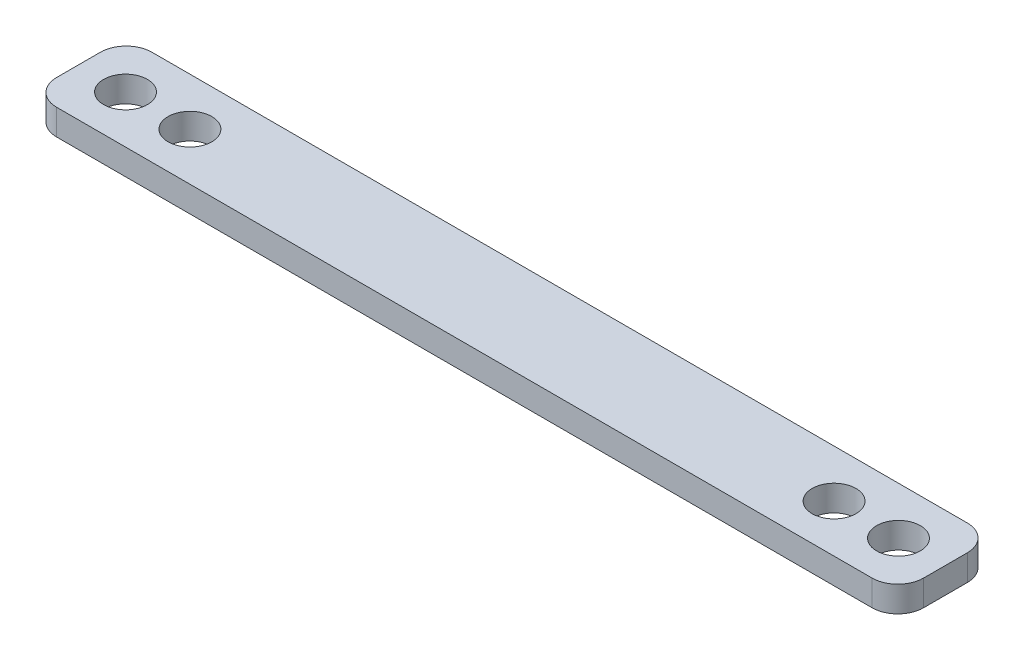
ISO-10303-21;
HEADER;
FILE_DESCRIPTION(('STEP AP214'),'2;1');
FILE_NAME('part.step','',(''),(''),'','','');
FILE_SCHEMA(('AUTOMOTIVE_DESIGN { 1 0 10303 214 1 1 1 1 }'));
ENDSEC;
DATA;
#1=APPLICATION_CONTEXT('core data for automotive mechanical design processes');
#2=APPLICATION_PROTOCOL_DEFINITION('international standard','automotive_design',2000,#1);
#3=PRODUCT_CONTEXT('',#1,'mechanical');
#4=PRODUCT('Part','Part','',(#3));
#5=PRODUCT_RELATED_PRODUCT_CATEGORY('part','',(#4));
#6=PRODUCT_DEFINITION_FORMATION('','',#4);
#7=PRODUCT_DEFINITION_CONTEXT('part definition',#1,'design');
#8=PRODUCT_DEFINITION('design','',#6,#7);
#9=PRODUCT_DEFINITION_SHAPE('','',#8);
#10=(LENGTH_UNIT() NAMED_UNIT(*) SI_UNIT(.MILLI.,.METRE.));
#11=(NAMED_UNIT(*) PLANE_ANGLE_UNIT() SI_UNIT($,.RADIAN.));
#12=(NAMED_UNIT(*) SI_UNIT($,.STERADIAN.) SOLID_ANGLE_UNIT());
#13=UNCERTAINTY_MEASURE_WITH_UNIT(LENGTH_MEASURE(1.E-05),#10,'distance_accuracy_value','');
#14=(GEOMETRIC_REPRESENTATION_CONTEXT(3) GLOBAL_UNCERTAINTY_ASSIGNED_CONTEXT((#13)) GLOBAL_UNIT_ASSIGNED_CONTEXT((#10,
#11,#12)) REPRESENTATION_CONTEXT('',''));
#15=CARTESIAN_POINT('',(0.,0.,0.));
#16=DIRECTION('',(0.,0.,1.));
#17=DIRECTION('',(1.,0.,0.));
#18=AXIS2_PLACEMENT_3D('',#15,#16,#17);
#19=CARTESIAN_POINT('',(0.,2.,-4.86679682508774));
#20=DIRECTION('',(0.,0.,1.));
#21=DIRECTION('',(1.,0.,0.));
#22=AXIS2_PLACEMENT_3D('',#19,#20,#21);
#23=PLANE('',#22);
#24=DIRECTION('',(-1.,0.,0.));
#25=VECTOR('',#24,1.);
#26=CARTESIAN_POINT('',(0.,0.,-4.86679682508774));
#27=LINE('',#26,#25);
#28=CARTESIAN_POINT('',(31.843938281881,0.,-4.86679682508774));
#29=VERTEX_POINT('',#28);
#30=CARTESIAN_POINT('',(-31.4560617181189,0.,-4.86679682508773));
#31=VERTEX_POINT('',#30);
#32=EDGE_CURVE('E153',#29,#31,#27,.T.);
#33=ORIENTED_EDGE('',*,*,#32,.T.);
#34=DIRECTION('',(0.,-1.,0.));
#35=VECTOR('',#34,1.);
#36=CARTESIAN_POINT('',(-31.4560617181189,2.,-4.86679682508773));
#37=LINE('',#36,#35);
#38=CARTESIAN_POINT('',(-31.4560617181189,2.,-4.86679682508773));
#39=VERTEX_POINT('',#38);
#40=EDGE_CURVE('E11',#39,#31,#37,.T.);
#41=ORIENTED_EDGE('',*,*,#40,.F.);
#42=DIRECTION('',(-1.,0.,0.));
#43=VECTOR('',#42,1.);
#44=CARTESIAN_POINT('',(0.,2.,-4.86679682508774));
#45=LINE('',#44,#43);
#46=CARTESIAN_POINT('',(31.843938281881,2.,-4.86679682508774));
#47=VERTEX_POINT('',#46);
#48=EDGE_CURVE('E198',#47,#39,#45,.T.);
#49=ORIENTED_EDGE('',*,*,#48,.F.);
#50=DIRECTION('',(0.,-1.,0.));
#51=VECTOR('',#50,1.);
#52=CARTESIAN_POINT('',(31.843938281881,2.,-4.86679682508774));
#53=LINE('',#52,#51);
#54=EDGE_CURVE('E60',#47,#29,#53,.T.);
#55=ORIENTED_EDGE('',*,*,#54,.T.);
#56=EDGE_LOOP('',(#33,#41,#49,#55));
#57=FACE_BOUND('',#56,.T.);
#58=ADVANCED_FACE('F43',(#57),#23,.F.);
#59=CARTESIAN_POINT('',(-31.456061718119,2.,-2.86679682508773));
#60=DIRECTION('',(0.,-1.,0.));
#61=DIRECTION('',(0.,0.,-1.));
#62=AXIS2_PLACEMENT_3D('',#59,#60,#61);
#63=CYLINDRICAL_SURFACE('',#62,2.);
#64=CARTESIAN_POINT('',(-31.456061718119,0.,-2.86679682508773));
#65=DIRECTION('',(0.,1.,0.));
#66=DIRECTION('',(0.,0.,1.));
#67=AXIS2_PLACEMENT_3D('',#64,#65,#66);
#68=CIRCLE('',#67,2.);
#69=CARTESIAN_POINT('',(-33.456061718119,0.,-2.86679682508772));
#70=VERTEX_POINT('',#69);
#71=EDGE_CURVE('E155',#31,#70,#68,.T.);
#72=ORIENTED_EDGE('',*,*,#71,.T.);
#73=DIRECTION('',(0.,-1.,0.));
#74=VECTOR('',#73,1.);
#75=CARTESIAN_POINT('',(-33.456061718119,2.,-2.86679682508772));
#76=LINE('',#75,#74);
#77=CARTESIAN_POINT('',(-33.456061718119,2.,-2.86679682508772));
#78=VERTEX_POINT('',#77);
#79=EDGE_CURVE('E52',#78,#70,#76,.T.);
#80=ORIENTED_EDGE('',*,*,#79,.F.);
#81=CARTESIAN_POINT('',(-31.456061718119,2.,-2.86679682508773));
#82=DIRECTION('',(0.,1.,0.));
#83=DIRECTION('',(0.,0.,1.));
#84=AXIS2_PLACEMENT_3D('',#81,#82,#83);
#85=CIRCLE('',#84,2.);
#86=EDGE_CURVE('E98',#39,#78,#85,.T.);
#87=ORIENTED_EDGE('',*,*,#86,.F.);
#88=ORIENTED_EDGE('',*,*,#40,.T.);
#89=EDGE_LOOP('',(#72,#80,#87,#88));
#90=FACE_BOUND('',#89,.T.);
#91=ADVANCED_FACE('F239',(#90),#63,.T.);
#92=CARTESIAN_POINT('',(-33.456061718119,2.,0.));
#93=DIRECTION('',(1.,0.,0.));
#94=DIRECTION('',(0.,0.,-1.));
#95=AXIS2_PLACEMENT_3D('',#92,#93,#94);
#96=PLANE('',#95);
#97=DIRECTION('',(0.,0.,1.));
#98=VECTOR('',#97,1.);
#99=CARTESIAN_POINT('',(-33.456061718119,0.,0.));
#100=LINE('',#99,#98);
#101=CARTESIAN_POINT('',(-33.456061718119,0.,0.533203174912255));
#102=VERTEX_POINT('',#101);
#103=EDGE_CURVE('E157',#70,#102,#100,.T.);
#104=ORIENTED_EDGE('',*,*,#103,.T.);
#105=DIRECTION('',(0.,-1.,0.));
#106=VECTOR('',#105,1.);
#107=CARTESIAN_POINT('',(-33.456061718119,2.,0.533203174912255));
#108=LINE('',#107,#106);
#109=CARTESIAN_POINT('',(-33.456061718119,2.,0.533203174912255));
#110=VERTEX_POINT('',#109);
#111=EDGE_CURVE('E178',#110,#102,#108,.T.);
#112=ORIENTED_EDGE('',*,*,#111,.F.);
#113=DIRECTION('',(0.,0.,1.));
#114=VECTOR('',#113,1.);
#115=CARTESIAN_POINT('',(-33.456061718119,2.,0.));
#116=LINE('',#115,#114);
#117=EDGE_CURVE('E185',#78,#110,#116,.T.);
#118=ORIENTED_EDGE('',*,*,#117,.F.);
#119=ORIENTED_EDGE('',*,*,#79,.T.);
#120=EDGE_LOOP('',(#104,#112,#118,#119));
#121=FACE_BOUND('',#120,.T.);
#122=ADVANCED_FACE('F183',(#121),#96,.F.);
#123=CARTESIAN_POINT('',(-31.456061718119,2.,0.533203174912269));
#124=DIRECTION('',(0.,-1.,0.));
#125=DIRECTION('',(0.,0.,-1.));
#126=AXIS2_PLACEMENT_3D('',#123,#124,#125);
#127=CYLINDRICAL_SURFACE('',#126,2.);
#128=CARTESIAN_POINT('',(-31.456061718119,0.,0.533203174912269));
#129=DIRECTION('',(0.,1.,0.));
#130=DIRECTION('',(0.,0.,1.));
#131=AXIS2_PLACEMENT_3D('',#128,#129,#130);
#132=CIRCLE('',#131,2.);
#133=CARTESIAN_POINT('',(-31.4560617181189,0.,2.53320317491227));
#134=VERTEX_POINT('',#133);
#135=EDGE_CURVE('E160',#134,#102,#132,.F.);
#136=ORIENTED_EDGE('',*,*,#135,.F.);
#137=DIRECTION('',(0.,-1.,0.));
#138=VECTOR('',#137,1.);
#139=CARTESIAN_POINT('',(-31.4560617181189,2.,2.53320317491227));
#140=LINE('',#139,#138);
#141=CARTESIAN_POINT('',(-31.4560617181189,2.,2.53320317491227));
#142=VERTEX_POINT('',#141);
#143=EDGE_CURVE('E176',#142,#134,#140,.T.);
#144=ORIENTED_EDGE('',*,*,#143,.F.);
#145=CARTESIAN_POINT('',(-31.456061718119,2.,0.533203174912269));
#146=DIRECTION('',(0.,1.,0.));
#147=DIRECTION('',(0.,0.,1.));
#148=AXIS2_PLACEMENT_3D('',#145,#146,#147);
#149=CIRCLE('',#148,2.);
#150=EDGE_CURVE('E193',#142,#110,#149,.F.);
#151=ORIENTED_EDGE('',*,*,#150,.T.);
#152=ORIENTED_EDGE('',*,*,#111,.T.);
#153=EDGE_LOOP('',(#136,#144,#151,#152));
#154=FACE_BOUND('',#153,.T.);
#155=ADVANCED_FACE('F191',(#154),#127,.T.);
#156=CARTESIAN_POINT('',(0.,2.,2.53320317491226));
#157=DIRECTION('',(0.,0.,1.));
#158=DIRECTION('',(1.,0.,0.));
#159=AXIS2_PLACEMENT_3D('',#156,#157,#158);
#160=PLANE('',#159);
#161=DIRECTION('',(-1.,0.,0.));
#162=VECTOR('',#161,1.);
#163=CARTESIAN_POINT('',(0.,0.,2.53320317491226));
#164=LINE('',#163,#162);
#165=CARTESIAN_POINT('',(31.843938281881,0.,2.53320317491226));
#166=VERTEX_POINT('',#165);
#167=EDGE_CURVE('E163',#166,#134,#164,.T.);
#168=ORIENTED_EDGE('',*,*,#167,.F.);
#169=DIRECTION('',(0.,-1.,0.));
#170=VECTOR('',#169,1.);
#171=CARTESIAN_POINT('',(31.843938281881,2.,2.53320317491226));
#172=LINE('',#171,#170);
#173=CARTESIAN_POINT('',(31.843938281881,2.,2.53320317491226));
#174=VERTEX_POINT('',#173);
#175=EDGE_CURVE('E123',#174,#166,#172,.T.);
#176=ORIENTED_EDGE('',*,*,#175,.F.);
#177=DIRECTION('',(-1.,0.,0.));
#178=VECTOR('',#177,1.);
#179=CARTESIAN_POINT('',(0.,2.,2.53320317491226));
#180=LINE('',#179,#178);
#181=EDGE_CURVE('E133',#174,#142,#180,.T.);
#182=ORIENTED_EDGE('',*,*,#181,.T.);
#183=ORIENTED_EDGE('',*,*,#143,.T.);
#184=EDGE_LOOP('',(#168,#176,#182,#183));
#185=FACE_BOUND('',#184,.T.);
#186=ADVANCED_FACE('F270',(#185),#160,.T.);
#187=CARTESIAN_POINT('',(31.843938281881,2.,0.533203174912262));
#188=DIRECTION('',(0.,-1.,0.));
#189=DIRECTION('',(0.,0.,-1.));
#190=AXIS2_PLACEMENT_3D('',#187,#188,#189);
#191=CYLINDRICAL_SURFACE('',#190,2.);
#192=CARTESIAN_POINT('',(31.843938281881,0.,0.533203174912262));
#193=DIRECTION('',(0.,1.,0.));
#194=DIRECTION('',(0.,0.,1.));
#195=AXIS2_PLACEMENT_3D('',#192,#193,#194);
#196=CIRCLE('',#195,2.);
#197=CARTESIAN_POINT('',(33.843938281881,0.,0.533203174912248));
#198=VERTEX_POINT('',#197);
#199=EDGE_CURVE('E119',#198,#166,#196,.F.);
#200=ORIENTED_EDGE('',*,*,#199,.F.);
#201=DIRECTION('',(0.,-1.,0.));
#202=VECTOR('',#201,1.);
#203=CARTESIAN_POINT('',(33.843938281881,2.,0.533203174912248));
#204=LINE('',#203,#202);
#205=CARTESIAN_POINT('',(33.843938281881,2.,0.533203174912248));
#206=VERTEX_POINT('',#205);
#207=EDGE_CURVE('E114',#206,#198,#204,.T.);
#208=ORIENTED_EDGE('',*,*,#207,.F.);
#209=CARTESIAN_POINT('',(31.843938281881,2.,0.533203174912262));
#210=DIRECTION('',(0.,1.,0.));
#211=DIRECTION('',(0.,0.,1.));
#212=AXIS2_PLACEMENT_3D('',#209,#210,#211);
#213=CIRCLE('',#212,2.);
#214=EDGE_CURVE('E117',#206,#174,#213,.F.);
#215=ORIENTED_EDGE('',*,*,#214,.T.);
#216=ORIENTED_EDGE('',*,*,#175,.T.);
#217=EDGE_LOOP('',(#200,#208,#215,#216));
#218=FACE_BOUND('',#217,.T.);
#219=ADVANCED_FACE('F116',(#218),#191,.T.);
#220=CARTESIAN_POINT('',(33.843938281881,2.,0.));
#221=DIRECTION('',(1.,0.,0.));
#222=DIRECTION('',(0.,0.,-1.));
#223=AXIS2_PLACEMENT_3D('',#220,#221,#222);
#224=PLANE('',#223);
#225=DIRECTION('',(0.,0.,1.));
#226=VECTOR('',#225,1.);
#227=CARTESIAN_POINT('',(33.843938281881,0.,0.));
#228=LINE('',#227,#226);
#229=CARTESIAN_POINT('',(33.843938281881,0.,-2.86679682508773));
#230=VERTEX_POINT('',#229);
#231=EDGE_CURVE('E167',#230,#198,#228,.T.);
#232=ORIENTED_EDGE('',*,*,#231,.F.);
#233=DIRECTION('',(0.,-1.,0.));
#234=VECTOR('',#233,1.);
#235=CARTESIAN_POINT('',(33.843938281881,2.,-2.86679682508773));
#236=LINE('',#235,#234);
#237=CARTESIAN_POINT('',(33.843938281881,2.,-2.86679682508773));
#238=VERTEX_POINT('',#237);
#239=EDGE_CURVE('E86',#238,#230,#236,.T.);
#240=ORIENTED_EDGE('',*,*,#239,.F.);
#241=DIRECTION('',(0.,0.,1.));
#242=VECTOR('',#241,1.);
#243=CARTESIAN_POINT('',(33.843938281881,2.,0.));
#244=LINE('',#243,#242);
#245=EDGE_CURVE('E130',#238,#206,#244,.T.);
#246=ORIENTED_EDGE('',*,*,#245,.T.);
#247=ORIENTED_EDGE('',*,*,#207,.T.);
#248=EDGE_LOOP('',(#232,#240,#246,#247));
#249=FACE_BOUND('',#248,.T.);
#250=ADVANCED_FACE('F135',(#249),#224,.T.);
#251=CARTESIAN_POINT('',(30.193938281881,2.,-1.16679682508773));
#252=DIRECTION('',(0.,-1.,0.));
#253=DIRECTION('',(0.,0.,-1.));
#254=AXIS2_PLACEMENT_3D('',#251,#252,#253);
#255=CYLINDRICAL_SURFACE('',#254,1.7);
#256=CARTESIAN_POINT('',(30.193938281881,2.,-1.16679682508773));
#257=DIRECTION('',(0.,1.,0.));
#258=DIRECTION('',(0.,0.,1.));
#259=AXIS2_PLACEMENT_3D('',#256,#257,#258);
#260=CIRCLE('',#259,1.7);
#261=CARTESIAN_POINT('',(30.193938281881,2.,0.533203174912268));
#262=VERTEX_POINT('',#261);
#263=EDGE_CURVE('E200',#262,#262,#260,.F.);
#264=ORIENTED_EDGE('',*,*,#263,.F.);
#265=EDGE_LOOP('',(#264));
#266=FACE_BOUND('',#265,.T.);
#267=CARTESIAN_POINT('',(30.193938281881,0.,-1.16679682508773));
#268=DIRECTION('',(0.,1.,0.));
#269=DIRECTION('',(0.,0.,1.));
#270=AXIS2_PLACEMENT_3D('',#267,#268,#269);
#271=CIRCLE('',#270,1.7);
#272=CARTESIAN_POINT('',(30.193938281881,0.,0.533203174912268));
#273=VERTEX_POINT('',#272);
#274=EDGE_CURVE('E150',#273,#273,#271,.F.);
#275=ORIENTED_EDGE('',*,*,#274,.T.);
#276=EDGE_LOOP('',(#275));
#277=FACE_BOUND('',#276,.T.);
#278=ADVANCED_FACE('F224',(#266,#277),#255,.F.);
#279=CARTESIAN_POINT('',(-29.806061718119,2.,-1.16679682508773));
#280=DIRECTION('',(0.,-1.,0.));
#281=DIRECTION('',(0.,0.,-1.));
#282=AXIS2_PLACEMENT_3D('',#279,#280,#281);
#283=CYLINDRICAL_SURFACE('',#282,1.7);
#284=CARTESIAN_POINT('',(-29.806061718119,2.,-1.16679682508773));
#285=DIRECTION('',(0.,1.,0.));
#286=DIRECTION('',(0.,0.,1.));
#287=AXIS2_PLACEMENT_3D('',#284,#285,#286);
#288=CIRCLE('',#287,1.7);
#289=CARTESIAN_POINT('',(-29.806061718119,2.,0.533203174912268));
#290=VERTEX_POINT('',#289);
#291=EDGE_CURVE('E203',#290,#290,#288,.T.);
#292=ORIENTED_EDGE('',*,*,#291,.T.);
#293=EDGE_LOOP('',(#292));
#294=FACE_BOUND('',#293,.T.);
#295=CARTESIAN_POINT('',(-29.806061718119,0.,-1.16679682508773));
#296=DIRECTION('',(0.,1.,0.));
#297=DIRECTION('',(0.,0.,1.));
#298=AXIS2_PLACEMENT_3D('',#295,#296,#297);
#299=CIRCLE('',#298,1.7);
#300=CARTESIAN_POINT('',(-29.806061718119,0.,0.533203174912268));
#301=VERTEX_POINT('',#300);
#302=EDGE_CURVE('E147',#301,#301,#299,.T.);
#303=ORIENTED_EDGE('',*,*,#302,.F.);
#304=EDGE_LOOP('',(#303));
#305=FACE_BOUND('',#304,.T.);
#306=ADVANCED_FACE('F227',(#294,#305),#283,.F.);
#307=CARTESIAN_POINT('',(25.193938281881,2.,-1.16679682508773));
#308=DIRECTION('',(0.,-1.,0.));
#309=DIRECTION('',(0.,0.,-1.));
#310=AXIS2_PLACEMENT_3D('',#307,#308,#309);
#311=CYLINDRICAL_SURFACE('',#310,1.7);
#312=CARTESIAN_POINT('',(25.193938281881,2.,-1.16679682508773));
#313=DIRECTION('',(0.,1.,0.));
#314=DIRECTION('',(0.,0.,1.));
#315=AXIS2_PLACEMENT_3D('',#312,#313,#314);
#316=CIRCLE('',#315,1.7);
#317=CARTESIAN_POINT('',(25.193938281881,2.,0.533203174912267));
#318=VERTEX_POINT('',#317);
#319=EDGE_CURVE('E206',#318,#318,#316,.F.);
#320=ORIENTED_EDGE('',*,*,#319,.F.);
#321=EDGE_LOOP('',(#320));
#322=FACE_BOUND('',#321,.T.);
#323=CARTESIAN_POINT('',(25.193938281881,0.,-1.16679682508773));
#324=DIRECTION('',(0.,1.,0.));
#325=DIRECTION('',(0.,0.,1.));
#326=AXIS2_PLACEMENT_3D('',#323,#324,#325);
#327=CIRCLE('',#326,1.7);
#328=CARTESIAN_POINT('',(25.193938281881,0.,0.533203174912267));
#329=VERTEX_POINT('',#328);
#330=EDGE_CURVE('E144',#329,#329,#327,.F.);
#331=ORIENTED_EDGE('',*,*,#330,.T.);
#332=EDGE_LOOP('',(#331));
#333=FACE_BOUND('',#332,.T.);
#334=ADVANCED_FACE('F248',(#322,#333),#311,.F.);
#335=CARTESIAN_POINT('',(-24.806061718119,2.,-1.16679682508773));
#336=DIRECTION('',(0.,-1.,0.));
#337=DIRECTION('',(0.,0.,-1.));
#338=AXIS2_PLACEMENT_3D('',#335,#336,#337);
#339=CYLINDRICAL_SURFACE('',#338,1.7);
#340=CARTESIAN_POINT('',(-24.806061718119,2.,-1.16679682508773));
#341=DIRECTION('',(0.,1.,0.));
#342=DIRECTION('',(0.,0.,1.));
#343=AXIS2_PLACEMENT_3D('',#340,#341,#342);
#344=CIRCLE('',#343,1.7);
#345=CARTESIAN_POINT('',(-24.806061718119,2.,0.533203174912267));
#346=VERTEX_POINT('',#345);
#347=EDGE_CURVE('E172',#346,#346,#344,.T.);
#348=ORIENTED_EDGE('',*,*,#347,.T.);
#349=EDGE_LOOP('',(#348));
#350=FACE_BOUND('',#349,.T.);
#351=CARTESIAN_POINT('',(-24.806061718119,0.,-1.16679682508773));
#352=DIRECTION('',(0.,1.,0.));
#353=DIRECTION('',(0.,0.,1.));
#354=AXIS2_PLACEMENT_3D('',#351,#352,#353);
#355=CIRCLE('',#354,1.7);
#356=CARTESIAN_POINT('',(-24.806061718119,0.,0.533203174912267));
#357=VERTEX_POINT('',#356);
#358=EDGE_CURVE('E141',#357,#357,#355,.T.);
#359=ORIENTED_EDGE('',*,*,#358,.F.);
#360=EDGE_LOOP('',(#359));
#361=FACE_BOUND('',#360,.T.);
#362=ADVANCED_FACE('F45',(#350,#361),#339,.F.);
#363=CARTESIAN_POINT('',(31.843938281881,2.,-2.86679682508774));
#364=DIRECTION('',(0.,-1.,0.));
#365=DIRECTION('',(0.,0.,-1.));
#366=AXIS2_PLACEMENT_3D('',#363,#364,#365);
#367=CYLINDRICAL_SURFACE('',#366,2.);
#368=CARTESIAN_POINT('',(31.843938281881,0.,-2.86679682508774));
#369=DIRECTION('',(0.,1.,0.));
#370=DIRECTION('',(0.,0.,1.));
#371=AXIS2_PLACEMENT_3D('',#368,#369,#370);
#372=CIRCLE('',#371,2.);
#373=EDGE_CURVE('E169',#29,#230,#372,.F.);
#374=ORIENTED_EDGE('',*,*,#373,.F.);
#375=ORIENTED_EDGE('',*,*,#54,.F.);
#376=CARTESIAN_POINT('',(31.843938281881,2.,-2.86679682508774));
#377=DIRECTION('',(0.,1.,0.));
#378=DIRECTION('',(0.,0.,1.));
#379=AXIS2_PLACEMENT_3D('',#376,#377,#378);
#380=CIRCLE('',#379,2.);
#381=EDGE_CURVE('E136',#47,#238,#380,.F.);
#382=ORIENTED_EDGE('',*,*,#381,.T.);
#383=ORIENTED_EDGE('',*,*,#239,.T.);
#384=EDGE_LOOP('',(#374,#375,#382,#383));
#385=FACE_BOUND('',#384,.T.);
#386=ADVANCED_FACE('F216',(#385),#367,.T.);
#387=CARTESIAN_POINT('',(0.,2.,0.));
#388=DIRECTION('',(0.,1.,0.));
#389=DIRECTION('',(0.,0.,1.));
#390=AXIS2_PLACEMENT_3D('',#387,#388,#389);
#391=PLANE('',#390);
#392=ORIENTED_EDGE('',*,*,#347,.F.);
#393=EDGE_LOOP('',(#392));
#394=FACE_BOUND('',#393,.T.);
#395=ORIENTED_EDGE('',*,*,#319,.T.);
#396=EDGE_LOOP('',(#395));
#397=FACE_BOUND('',#396,.T.);
#398=ORIENTED_EDGE('',*,*,#291,.F.);
#399=EDGE_LOOP('',(#398));
#400=FACE_BOUND('',#399,.T.);
#401=ORIENTED_EDGE('',*,*,#263,.T.);
#402=EDGE_LOOP('',(#401));
#403=FACE_BOUND('',#402,.T.);
#404=ORIENTED_EDGE('',*,*,#48,.T.);
#405=ORIENTED_EDGE('',*,*,#86,.T.);
#406=ORIENTED_EDGE('',*,*,#117,.T.);
#407=ORIENTED_EDGE('',*,*,#150,.F.);
#408=ORIENTED_EDGE('',*,*,#181,.F.);
#409=ORIENTED_EDGE('',*,*,#214,.F.);
#410=ORIENTED_EDGE('',*,*,#245,.F.);
#411=ORIENTED_EDGE('',*,*,#381,.F.);
#412=EDGE_LOOP('',(#404,#405,#406,#407,#408,#409,#410,#411));
#413=FACE_BOUND('',#412,.T.);
#414=ADVANCED_FACE('F128',(#394,#397,#400,#403,#413),#391,.T.);
#415=CARTESIAN_POINT('',(0.,0.,0.));
#416=DIRECTION('',(0.,1.,0.));
#417=DIRECTION('',(0.,0.,1.));
#418=AXIS2_PLACEMENT_3D('',#415,#416,#417);
#419=PLANE('',#418);
#420=ORIENTED_EDGE('',*,*,#358,.T.);
#421=EDGE_LOOP('',(#420));
#422=FACE_BOUND('',#421,.T.);
#423=ORIENTED_EDGE('',*,*,#330,.F.);
#424=EDGE_LOOP('',(#423));
#425=FACE_BOUND('',#424,.T.);
#426=ORIENTED_EDGE('',*,*,#302,.T.);
#427=EDGE_LOOP('',(#426));
#428=FACE_BOUND('',#427,.T.);
#429=ORIENTED_EDGE('',*,*,#274,.F.);
#430=EDGE_LOOP('',(#429));
#431=FACE_BOUND('',#430,.T.);
#432=ORIENTED_EDGE('',*,*,#32,.F.);
#433=ORIENTED_EDGE('',*,*,#373,.T.);
#434=ORIENTED_EDGE('',*,*,#231,.T.);
#435=ORIENTED_EDGE('',*,*,#199,.T.);
#436=ORIENTED_EDGE('',*,*,#167,.T.);
#437=ORIENTED_EDGE('',*,*,#135,.T.);
#438=ORIENTED_EDGE('',*,*,#103,.F.);
#439=ORIENTED_EDGE('',*,*,#71,.F.);
#440=EDGE_LOOP('',(#432,#433,#434,#435,#436,#437,#438,#439));
#441=FACE_BOUND('',#440,.T.);
#442=ADVANCED_FACE('F187',(#422,#425,#428,#431,#441),#419,.F.);
#443=CLOSED_SHELL('',(#58,#91,#122,#155,#186,#219,#250,#278,#306,#334,#362,#386,#414,#442));
#444=MANIFOLD_SOLID_BREP('B2',#443);
#445=ADVANCED_BREP_SHAPE_REPRESENTATION('',(#18,#444),#14);
#446=SHAPE_DEFINITION_REPRESENTATION(#9,#445);
ENDSEC;
END-ISO-10303-21;
